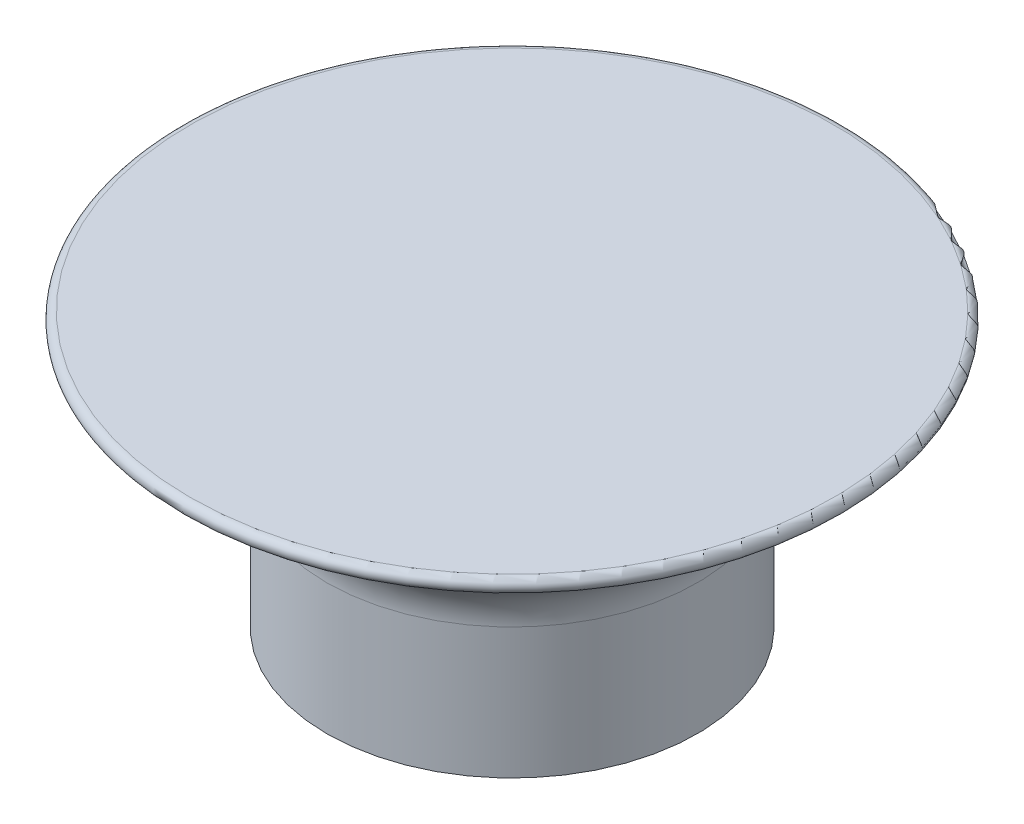
ISO-10303-21;
HEADER;
FILE_DESCRIPTION(('STEP AP214'),'2;1');
FILE_NAME('part.step','',(''),(''),'','','');
FILE_SCHEMA(('AUTOMOTIVE_DESIGN { 1 0 10303 214 1 1 1 1 }'));
ENDSEC;
DATA;
#1=APPLICATION_CONTEXT('core data for automotive mechanical design processes');
#2=APPLICATION_PROTOCOL_DEFINITION('international standard','automotive_design',2000,#1);
#3=PRODUCT_CONTEXT('',#1,'mechanical');
#4=PRODUCT('Part','Part','',(#3));
#5=PRODUCT_RELATED_PRODUCT_CATEGORY('part','',(#4));
#6=PRODUCT_DEFINITION_FORMATION('','',#4);
#7=PRODUCT_DEFINITION_CONTEXT('part definition',#1,'design');
#8=PRODUCT_DEFINITION('design','',#6,#7);
#9=PRODUCT_DEFINITION_SHAPE('','',#8);
#10=(LENGTH_UNIT() NAMED_UNIT(*) SI_UNIT(.MILLI.,.METRE.));
#11=(NAMED_UNIT(*) PLANE_ANGLE_UNIT() SI_UNIT($,.RADIAN.));
#12=(NAMED_UNIT(*) SI_UNIT($,.STERADIAN.) SOLID_ANGLE_UNIT());
#13=UNCERTAINTY_MEASURE_WITH_UNIT(LENGTH_MEASURE(1.E-05),#10,'distance_accuracy_value','');
#14=(GEOMETRIC_REPRESENTATION_CONTEXT(3) GLOBAL_UNCERTAINTY_ASSIGNED_CONTEXT((#13)) GLOBAL_UNIT_ASSIGNED_CONTEXT((#10,
#11,#12)) REPRESENTATION_CONTEXT('',''));
#15=CARTESIAN_POINT('',(0.,0.,0.));
#16=DIRECTION('',(0.,0.,1.));
#17=DIRECTION('',(1.,0.,0.));
#18=AXIS2_PLACEMENT_3D('',#15,#16,#17);
#19=CARTESIAN_POINT('',(0.,0.,0.));
#20=DIRECTION('',(0.,1.,0.));
#21=DIRECTION('',(0.,0.,1.));
#22=AXIS2_PLACEMENT_3D('',#19,#20,#21);
#23=PLANE('',#22);
#24=CARTESIAN_POINT('',(0.,0.,0.));
#25=DIRECTION('',(0.,1.,0.));
#26=DIRECTION('',(0.,0.,1.));
#27=AXIS2_PLACEMENT_3D('',#24,#25,#26);
#28=CIRCLE('',#27,7.747);
#29=CARTESIAN_POINT('',(0.,0.,7.747));
#30=VERTEX_POINT('',#29);
#31=EDGE_CURVE('E54',#30,#30,#28,.T.);
#32=ORIENTED_EDGE('',*,*,#31,.F.);
#33=EDGE_LOOP('',(#32));
#34=FACE_BOUND('',#33,.T.);
#35=CARTESIAN_POINT('',(0.,0.,0.));
#36=DIRECTION('',(0.,1.,0.));
#37=DIRECTION('',(0.,0.,1.));
#38=AXIS2_PLACEMENT_3D('',#35,#36,#37);
#39=CIRCLE('',#38,3.937);
#40=CARTESIAN_POINT('',(0.,0.,3.937));
#41=VERTEX_POINT('',#40);
#42=EDGE_CURVE('E57',#41,#41,#39,.T.);
#43=ORIENTED_EDGE('',*,*,#42,.T.);
#44=EDGE_LOOP('',(#43));
#45=FACE_BOUND('',#44,.T.);
#46=ADVANCED_FACE('F34',(#34,#45),#23,.F.);
#47=CARTESIAN_POINT('',(0.,6.35,0.));
#48=DIRECTION('',(0.,-1.,0.));
#49=DIRECTION('',(0.,0.,-1.));
#50=AXIS2_PLACEMENT_3D('',#47,#48,#49);
#51=CYLINDRICAL_SURFACE('',#50,7.747);
#52=CARTESIAN_POINT('',(0.,5.46656849505794,0.));
#53=DIRECTION('',(0.,1.,0.));
#54=DIRECTION('',(0.,0.,1.));
#55=AXIS2_PLACEMENT_3D('',#52,#53,#54);
#56=CIRCLE('',#55,7.747);
#57=CARTESIAN_POINT('',(0.,5.46656849505794,7.747));
#58=VERTEX_POINT('',#57);
#59=EDGE_CURVE('E11',#58,#58,#56,.F.);
#60=ORIENTED_EDGE('',*,*,#59,.T.);
#61=EDGE_LOOP('',(#60));
#62=FACE_BOUND('',#61,.T.);
#63=ORIENTED_EDGE('',*,*,#31,.T.);
#64=EDGE_LOOP('',(#63));
#65=FACE_BOUND('',#64,.T.);
#66=ADVANCED_FACE('F78',(#62,#65),#51,.T.);
#67=CARTESIAN_POINT('',(0.,6.35,0.));
#68=DIRECTION('',(0.,-1.,0.));
#69=DIRECTION('',(0.,0.,-1.));
#70=AXIS2_PLACEMENT_3D('',#67,#68,#69);
#71=CYLINDRICAL_SURFACE('',#70,3.937);
#72=CARTESIAN_POINT('',(0.,6.35,0.));
#73=DIRECTION('',(0.,1.,0.));
#74=DIRECTION('',(0.,0.,1.));
#75=AXIS2_PLACEMENT_3D('',#72,#73,#74);
#76=CIRCLE('',#75,3.937);
#77=CARTESIAN_POINT('',(0.,6.35,3.937));
#78=VERTEX_POINT('',#77);
#79=EDGE_CURVE('E60',#78,#78,#76,.T.);
#80=ORIENTED_EDGE('',*,*,#79,.T.);
#81=EDGE_LOOP('',(#80));
#82=FACE_BOUND('',#81,.T.);
#83=ORIENTED_EDGE('',*,*,#42,.F.);
#84=EDGE_LOOP('',(#83));
#85=FACE_BOUND('',#84,.T.);
#86=ADVANCED_FACE('F64',(#82,#85),#71,.F.);
#87=CARTESIAN_POINT('',(0.,6.35,0.));
#88=DIRECTION('',(0.,1.,0.));
#89=DIRECTION('',(0.,0.,1.));
#90=AXIS2_PLACEMENT_3D('',#87,#88,#89);
#91=PLANE('',#90);
#92=ORIENTED_EDGE('',*,*,#79,.F.);
#93=EDGE_LOOP('',(#92));
#94=FACE_BOUND('',#93,.T.);
#95=ADVANCED_FACE('F67',(#94),#91,.F.);
#96=CARTESIAN_POINT('',(0.,11.43,0.));
#97=DIRECTION('',(0.,1.,0.));
#98=DIRECTION('',(0.,0.,1.));
#99=AXIS2_PLACEMENT_3D('',#96,#97,#98);
#100=PLANE('',#99);
#101=CARTESIAN_POINT('',(0.,11.43,0.));
#102=DIRECTION('',(0.,1.,0.));
#103=DIRECTION('',(0.,0.,1.));
#104=AXIS2_PLACEMENT_3D('',#101,#102,#103);
#105=CIRCLE('',#104,13.475286623021);
#106=CARTESIAN_POINT('',(0.,11.43,13.475286623021));
#107=VERTEX_POINT('',#106);
#108=EDGE_CURVE('E49',#107,#107,#105,.T.);
#109=ORIENTED_EDGE('',*,*,#108,.T.);
#110=EDGE_LOOP('',(#109));
#111=FACE_BOUND('',#110,.T.);
#112=ADVANCED_FACE('F69',(#111),#100,.T.);
#113=CARTESIAN_POINT('',(-6.20355431132952,6.35,4.64025030643659));
#114=CARTESIAN_POINT('',(-2.86279328532816,11.43,14.3216772623));
#115=CARTESIAN_POINT('',(3.07694630154365,6.35,17.0473589290956));
#116=CARTESIAN_POINT('',(25.7805612392718,11.43,20.0472638329563));
#117=CARTESIAN_POINT('',(15.4840549242027,6.35,7.76685831622246));
#118=CARTESIAN_POINT('',(31.5061478099281,11.43,-8.59609069164369));
#119=CARTESIAN_POINT('',(6.20355431132953,6.35,-4.64025030643659));
#120=CARTESIAN_POINT('',(2.86279328532814,11.43,-14.3216772623));
#121=CARTESIAN_POINT('',(-3.07694630154364,6.35,-17.0473589290956));
#122=CARTESIAN_POINT('',(-25.7805612392718,11.43,-20.0472638329563));
#123=CARTESIAN_POINT('',(-15.4840549242027,6.35,-7.76685831622247));
#124=CARTESIAN_POINT('',(-31.5061478099281,11.43,8.59609069164369));
#125=CARTESIAN_POINT('',(-6.20355431132952,6.35,4.64025030643659));
#126=CARTESIAN_POINT('',(-2.86279328532816,11.43,14.3216772623));
#127=(BOUNDED_SURFACE() B_SPLINE_SURFACE(3,1,((#113,#114),(#115,#116),(#117,#118),(#119,#120),
(#121,#122),(#123,#124),(#125,#126)),.UNSPECIFIED.,.T.,.F.,.F.) B_SPLINE_SURFACE_WITH_KNOTS((4,
3,4),(2,2),(0.,0.5,1.),(0.,1.),
.UNSPECIFIED.) GEOMETRIC_REPRESENTATION_ITEM() RATIONAL_B_SPLINE_SURFACE(((1.,1.),
(0.333333333333334,0.333333333333333),(0.333333333333334,0.333333333333333),(1.,1.),
(0.333333333333333,0.333333333333333),(0.333333333333333,0.333333333333333),(1.,1.))) REPRESENTATION_ITEM('') SURFACE());
#128=CARTESIAN_POINT('',(0.,7.25981107277655,0.));
#129=DIRECTION('',(0.,1.,0.));
#130=DIRECTION('',(0.,0.,1.));
#131=AXIS2_PLACEMENT_3D('',#128,#129,#130);
#132=CIRCLE('',#131,8.48814451457124);
#133=CARTESIAN_POINT('',(-5.60523514342472,7.25981107277655,6.37416161445271));
#134=VERTEX_POINT('',#133);
#135=EDGE_CURVE('E41',#134,#134,#132,.T.);
#136=CARTESIAN_POINT('',(0.,10.8626744865764,0.));
#137=DIRECTION('',(0.,1.,0.));
#138=DIRECTION('',(0.,0.,1.));
#139=AXIS2_PLACEMENT_3D('',#136,#137,#138);
#140=CIRCLE('',#139,13.630152354549);
#141=CARTESIAN_POINT('',(-3.23588363263165,10.8626744865764,13.2404724358417));
#142=VERTEX_POINT('',#141);
#143=EDGE_CURVE('E45',#142,#142,#140,.F.);
#144=CARTESIAN_POINT('',(-5.60523514342472,7.25981107277655,6.37416161445271));
#145=CARTESIAN_POINT('',(-5.58055439852063,7.29734090000363,6.44568568550884));
#146=CARTESIAN_POINT('',(-5.55587365361653,7.33487072723072,6.51720975656498));
#147=CARTESIAN_POINT('',(-5.50651216380834,7.40993038168488,6.66025789867725));
#148=CARTESIAN_POINT('',(-5.48183141890425,7.44746020891196,6.73178196973338));
#149=CARTESIAN_POINT('',(-5.43246992909606,7.52251986336612,6.87483011184565));
#150=CARTESIAN_POINT('',(-5.40778918419196,7.56004969059321,6.94635418290179));
#151=CARTESIAN_POINT('',(-5.35842769438378,7.63510934504737,7.08940232501406));
#152=CARTESIAN_POINT('',(-5.33374694947968,7.67263917227445,7.1609263960702));
#153=CARTESIAN_POINT('',(-5.28438545967149,7.74769882672862,7.30397453818247));
#154=CARTESIAN_POINT('',(-5.2597047147674,7.7852286539557,7.3754986092386));
#155=CARTESIAN_POINT('',(-5.21034322495921,7.86028830840986,7.51854675135087));
#156=CARTESIAN_POINT('',(-5.18566248005512,7.89781813563694,7.59007082240701));
#157=CARTESIAN_POINT('',(-5.13630099024693,7.9728777900911,7.73311896451928));
#158=CARTESIAN_POINT('',(-5.11162024534283,8.01040761731819,7.80464303557541));
#159=CARTESIAN_POINT('',(-5.06225875553464,8.08546727177235,7.94769117768768));
#160=CARTESIAN_POINT('',(-5.03757801063055,8.12299709899944,8.01921524874382));
#161=CARTESIAN_POINT('',(-4.98821652082236,8.1980567534536,8.16226339085609));
#162=CARTESIAN_POINT('',(-4.96353577591826,8.23558658068068,8.23378746191222));
#163=CARTESIAN_POINT('',(-4.91417428611007,8.31064623513484,8.37683560402449));
#164=CARTESIAN_POINT('',(-4.88949354120598,8.34817606236193,8.44835967508063));
#165=CARTESIAN_POINT('',(-4.84013205139779,8.42323571681609,8.59140781719289));
#166=CARTESIAN_POINT('',(-4.8154513064937,8.46076554404317,8.66293188824903));
#167=CARTESIAN_POINT('',(-4.76608981668551,8.53582519849734,8.8059800303613));
#168=CARTESIAN_POINT('',(-4.74140907178141,8.57335502572442,8.87750410141744));
#169=CARTESIAN_POINT('',(-4.69204758197322,8.64841468017858,9.02055224352971));
#170=CARTESIAN_POINT('',(-4.66736683706913,8.68594450740566,9.09207631458584));
#171=CARTESIAN_POINT('',(-4.61800534726094,8.76100416185982,9.23512445669811));
#172=CARTESIAN_POINT('',(-4.59332460235685,8.79853398908691,9.30664852775425));
#173=CARTESIAN_POINT('',(-4.54396311254866,8.87359364354107,9.44969666986652));
#174=CARTESIAN_POINT('',(-4.51928236764456,8.91112347076815,9.52122074092265));
#175=CARTESIAN_POINT('',(-4.46992087783637,8.98618312522232,9.66426888303492));
#176=CARTESIAN_POINT('',(-4.44524013293228,9.0237129524494,9.73579295409106));
#177=CARTESIAN_POINT('',(-4.39587864312409,9.09877260690356,9.87884109620333));
#178=CARTESIAN_POINT('',(-4.37119789821999,9.13630243413064,9.95036516725946));
#179=CARTESIAN_POINT('',(-4.32183640841181,9.21136208858481,10.0934133093717));
#180=CARTESIAN_POINT('',(-4.29715566350771,9.24889191581189,10.1649373804279));
#181=CARTESIAN_POINT('',(-4.24779417369952,9.32395157026606,10.3079855225401));
#182=CARTESIAN_POINT('',(-4.22311342879543,9.36148139749314,10.3795095935963));
#183=CARTESIAN_POINT('',(-4.17375193898724,9.4365410519473,10.5225577357085));
#184=CARTESIAN_POINT('',(-4.14907119408315,9.47407087917438,10.5940818067647));
#185=CARTESIAN_POINT('',(-4.09970970427496,9.54913053362855,10.7371299488769));
#186=CARTESIAN_POINT('',(-4.07502895937086,9.58666036085563,10.8086540199331));
#187=CARTESIAN_POINT('',(-4.02566746956267,9.66172001530979,10.9517021620454));
#188=CARTESIAN_POINT('',(-4.00098672465858,9.69924984253687,11.0232262331015));
#189=CARTESIAN_POINT('',(-3.95162523485039,9.77430949699104,11.1662743752138));
#190=CARTESIAN_POINT('',(-3.92694448994629,9.81183932421812,11.2377984462699));
#191=CARTESIAN_POINT('',(-3.87758300013811,9.88689897867228,11.3808465883822));
#192=CARTESIAN_POINT('',(-3.85290225523401,9.92442880589936,11.4523706594383));
#193=CARTESIAN_POINT('',(-3.80354076542582,9.99948846035353,11.5954188015506));
#194=CARTESIAN_POINT('',(-3.77886002052173,10.0370182875806,11.6669428726067));
#195=CARTESIAN_POINT('',(-3.72949853071354,10.1120779420348,11.809991014719));
#196=CARTESIAN_POINT('',(-3.70481778580944,10.1496077692619,11.8815150857751));
#197=CARTESIAN_POINT('',(-3.65545629600125,10.224667423716,12.0245632278874));
#198=CARTESIAN_POINT('',(-3.63077555109716,10.2621972509431,12.0960872989435));
#199=CARTESIAN_POINT('',(-3.58141406128897,10.3372569053973,12.2391354410558));
#200=CARTESIAN_POINT('',(-3.55673331638488,10.3747867326243,12.3106595121119));
#201=CARTESIAN_POINT('',(-3.50737182657669,10.4498463870785,12.4537076542242));
#202=CARTESIAN_POINT('',(-3.48269108167259,10.4873762143056,12.5252317252803));
#203=CARTESIAN_POINT('',(-3.4333295918644,10.5624358687598,12.6682798673926));
#204=CARTESIAN_POINT('',(-3.40864884696031,10.5999656959868,12.7398039384487));
#205=CARTESIAN_POINT('',(-3.35928735715212,10.675025350441,12.882852080561));
#206=CARTESIAN_POINT('',(-3.33460661224803,10.7125551776681,12.9543761516171));
#207=CARTESIAN_POINT('',(-3.28524512243984,10.7876148321222,13.0974242937294));
#208=CARTESIAN_POINT('',(-3.26056437753574,10.8251446593493,13.1689483647855));
#209=CARTESIAN_POINT('',(-3.23588363263165,10.8626744865764,13.2404724358417));
#210=B_SPLINE_CURVE_WITH_KNOTS('',3,(#144,#145,#146,#147,#148,#149,#150,#151,#152,#153,#154,
#155,#156,#157,#158,#159,#160,#161,#162,#163,#164,#165,#166,#167,#168,#169,#170,#171,#172,#173,
#174,#175,#176,#177,#178,#179,#180,#181,#182,#183,#184,#185,#186,#187,#188,#189,#190,#191,#192,
#193,#194,#195,#196,#197,#198,#199,#200,#201,#202,#203,#204,#205,#206,#207,#208,#209),
.UNSPECIFIED.,.F.,.F.,(4,2,2,2,2,2,2,2,2,2,2,2,2,2,2,2,2,2,2,2,2,2,2,2,2,2,2,2,2,2,2,2,4),(0.,
0.253376949564139,0.506753899128277,0.760130848692415,1.01350779825655,1.26688474782069,
1.52026169738483,1.77363864694897,2.02701559651311,2.28039254607725,2.53376949564138,
2.78714644520552,3.04052339476966,3.2939003443338,3.54727729389794,3.80065424346208,
4.05403119302622,4.30740814259035,4.56078509215449,4.81416204171863,5.06753899128277,
5.32091594084691,5.57429289041105,5.82766983997518,6.08104678953932,6.33442373910346,
6.5878006886676,6.84117763823174,7.09455458779587,7.34793153736001,7.60130848692415,
7.85468543648829,8.10806238605243),.UNSPECIFIED.);
#211=EDGE_CURVE('BSEAM75',#134,#142,#210,.T.);
#212=ORIENTED_EDGE('',*,*,#135,.T.);
#213=ORIENTED_EDGE('',*,*,#143,.T.);
#214=ORIENTED_EDGE('',*,*,#211,.T.);
#215=ORIENTED_EDGE('',*,*,#211,.F.);
#216=EDGE_LOOP('',(#212,#214,#213,#215));
#217=FACE_BOUND('',#216,.T.);
#218=ADVANCED_FACE('F75',(#217),#127,.T.);
#219=CARTESIAN_POINT('',(0.,11.1252,0.));
#220=DIRECTION('',(0.,1.,0.));
#221=DIRECTION('',(0.,0.,1.));
#222=AXIS2_PLACEMENT_3D('',#219,#220,#221);
#223=TOROIDAL_SURFACE('',#222,13.475286623021,0.3048);
#224=ORIENTED_EDGE('',*,*,#143,.F.);
#225=EDGE_LOOP('',(#224));
#226=FACE_BOUND('',#225,.T.);
#227=ORIENTED_EDGE('',*,*,#108,.F.);
#228=EDGE_LOOP('',(#227));
#229=FACE_BOUND('',#228,.T.);
#230=ADVANCED_FACE('F90',(#226,#229),#223,.T.);
#231=CARTESIAN_POINT('',(0.,5.46656849505794,0.));
#232=DIRECTION('',(0.,1.,0.));
#233=DIRECTION('',(0.,0.,1.));
#234=AXIS2_PLACEMENT_3D('',#231,#232,#233);
#235=TOROIDAL_SURFACE('',#234,10.287,2.54);
#236=ORIENTED_EDGE('',*,*,#59,.F.);
#237=EDGE_LOOP('',(#236));
#238=FACE_BOUND('',#237,.T.);
#239=ORIENTED_EDGE('',*,*,#135,.F.);
#240=EDGE_LOOP('',(#239));
#241=FACE_BOUND('',#240,.T.);
#242=ADVANCED_FACE('F36',(#238,#241),#235,.F.);
#243=CLOSED_SHELL('',(#46,#66,#86,#95,#112,#218,#230,#242));
#244=MANIFOLD_SOLID_BREP('B2',#243);
#245=ADVANCED_BREP_SHAPE_REPRESENTATION('',(#18,#244),#14);
#246=SHAPE_DEFINITION_REPRESENTATION(#9,#245);
ENDSEC;
END-ISO-10303-21;
